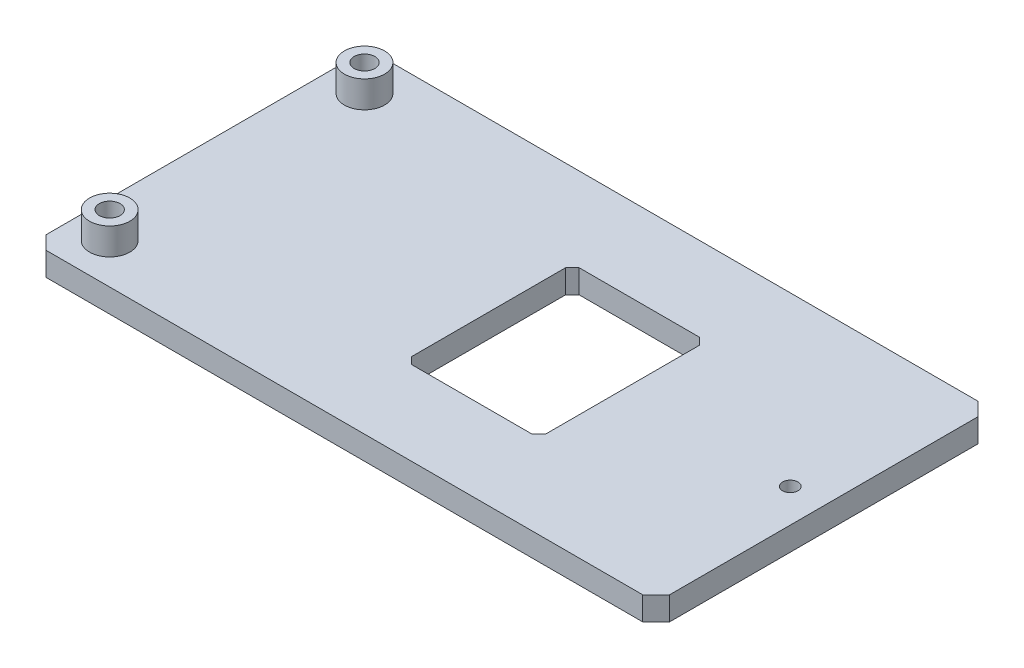
ISO-10303-21;
HEADER;
FILE_DESCRIPTION(('STEP AP214'),'2;1');
FILE_NAME('part.step','',(''),(''),'','','');
FILE_SCHEMA(('AUTOMOTIVE_DESIGN { 1 0 10303 214 1 1 1 1 }'));
ENDSEC;
DATA;
#1=APPLICATION_CONTEXT('core data for automotive mechanical design processes');
#2=APPLICATION_PROTOCOL_DEFINITION('international standard','automotive_design',2000,#1);
#3=PRODUCT_CONTEXT('',#1,'mechanical');
#4=PRODUCT('Part','Part','',(#3));
#5=PRODUCT_RELATED_PRODUCT_CATEGORY('part','',(#4));
#6=PRODUCT_DEFINITION_FORMATION('','',#4);
#7=PRODUCT_DEFINITION_CONTEXT('part definition',#1,'design');
#8=PRODUCT_DEFINITION('design','',#6,#7);
#9=PRODUCT_DEFINITION_SHAPE('','',#8);
#10=(LENGTH_UNIT() NAMED_UNIT(*) SI_UNIT(.MILLI.,.METRE.));
#11=(NAMED_UNIT(*) PLANE_ANGLE_UNIT() SI_UNIT($,.RADIAN.));
#12=(NAMED_UNIT(*) SI_UNIT($,.STERADIAN.) SOLID_ANGLE_UNIT());
#13=UNCERTAINTY_MEASURE_WITH_UNIT(LENGTH_MEASURE(1.E-05),#10,'distance_accuracy_value','');
#14=(GEOMETRIC_REPRESENTATION_CONTEXT(3) GLOBAL_UNCERTAINTY_ASSIGNED_CONTEXT((#13)) GLOBAL_UNIT_ASSIGNED_CONTEXT((#10,
#11,#12)) REPRESENTATION_CONTEXT('',''));
#15=CARTESIAN_POINT('',(0.,0.,0.));
#16=DIRECTION('',(0.,0.,1.));
#17=DIRECTION('',(1.,0.,0.));
#18=AXIS2_PLACEMENT_3D('',#15,#16,#17);
#19=CARTESIAN_POINT('',(0.,3.,0.));
#20=DIRECTION('',(0.,1.,0.));
#21=DIRECTION('',(0.,0.,1.));
#22=AXIS2_PLACEMENT_3D('',#19,#20,#21);
#23=PLANE('',#22);
#24=CARTESIAN_POINT('',(-45.1742624214534,3.,-19.));
#25=DIRECTION('',(0.,1.,0.));
#26=DIRECTION('',(0.,0.,1.));
#27=AXIS2_PLACEMENT_3D('',#24,#25,#26);
#28=CIRCLE('',#27,3.);
#29=CARTESIAN_POINT('',(-45.1742624214534,3.,-16.));
#30=VERTEX_POINT('',#29);
#31=EDGE_CURVE('E400',#30,#30,#28,.T.);
#32=ORIENTED_EDGE('',*,*,#31,.F.);
#33=EDGE_LOOP('',(#32));
#34=FACE_BOUND('',#33,.T.);
#35=DIRECTION('',(-0.707106781186546,0.,-0.707106781186549));
#36=VECTOR('',#35,1.);
#37=CARTESIAN_POINT('',(42.3257375785466,3.,-23.));
#38=LINE('',#37,#36);
#39=CARTESIAN_POINT('',(42.3257375785466,3.,-23.));
#40=VERTEX_POINT('',#39);
#41=CARTESIAN_POINT('',(40.3257375785466,3.,-25.));
#42=VERTEX_POINT('',#41);
#43=EDGE_CURVE('E195',#40,#42,#38,.T.);
#44=ORIENTED_EDGE('',*,*,#43,.T.);
#45=DIRECTION('',(-1.,0.,0.));
#46=VECTOR('',#45,1.);
#47=CARTESIAN_POINT('',(-48.6742624214534,3.,-25.));
#48=LINE('',#47,#46);
#49=CARTESIAN_POINT('',(-48.6742624214534,3.,-25.));
#50=VERTEX_POINT('',#49);
#51=EDGE_CURVE('E198',#42,#50,#48,.T.);
#52=ORIENTED_EDGE('',*,*,#51,.T.);
#53=DIRECTION('',(-0.707106781186547,0.,0.707106781186547));
#54=VECTOR('',#53,1.);
#55=CARTESIAN_POINT('',(-48.6742624214534,3.,-25.));
#56=LINE('',#55,#54);
#57=CARTESIAN_POINT('',(-50.6742624214534,3.,-23.));
#58=VERTEX_POINT('',#57);
#59=EDGE_CURVE('E201',#50,#58,#56,.T.);
#60=ORIENTED_EDGE('',*,*,#59,.T.);
#61=DIRECTION('',(0.,0.,1.));
#62=VECTOR('',#61,1.);
#63=CARTESIAN_POINT('',(-50.6742624214534,3.,-23.));
#64=LINE('',#63,#62);
#65=CARTESIAN_POINT('',(-50.6742624214534,3.,23.));
#66=VERTEX_POINT('',#65);
#67=EDGE_CURVE('E204',#58,#66,#64,.T.);
#68=ORIENTED_EDGE('',*,*,#67,.T.);
#69=DIRECTION('',(0.707106781186547,0.,0.707106781186547));
#70=VECTOR('',#69,1.);
#71=CARTESIAN_POINT('',(-50.6742624214534,3.,23.));
#72=LINE('',#71,#70);
#73=CARTESIAN_POINT('',(-48.6742624214534,3.,25.));
#74=VERTEX_POINT('',#73);
#75=EDGE_CURVE('E207',#66,#74,#72,.T.);
#76=ORIENTED_EDGE('',*,*,#75,.T.);
#77=DIRECTION('',(1.,0.,0.));
#78=VECTOR('',#77,1.);
#79=CARTESIAN_POINT('',(-48.6742624214534,3.,25.));
#80=LINE('',#79,#78);
#81=CARTESIAN_POINT('',(40.3257375785466,3.,25.));
#82=VERTEX_POINT('',#81);
#83=EDGE_CURVE('E210',#74,#82,#80,.T.);
#84=ORIENTED_EDGE('',*,*,#83,.T.);
#85=DIRECTION('',(0.707106781186546,0.,-0.707106781186549));
#86=VECTOR('',#85,1.);
#87=CARTESIAN_POINT('',(40.3257375785466,3.,25.));
#88=LINE('',#87,#86);
#89=CARTESIAN_POINT('',(42.3257375785466,3.,23.));
#90=VERTEX_POINT('',#89);
#91=EDGE_CURVE('E213',#82,#90,#88,.T.);
#92=ORIENTED_EDGE('',*,*,#91,.T.);
#93=DIRECTION('',(0.,0.,-1.));
#94=VECTOR('',#93,1.);
#95=CARTESIAN_POINT('',(42.3257375785466,3.,23.));
#96=LINE('',#95,#94);
#97=EDGE_CURVE('E216',#90,#40,#96,.T.);
#98=ORIENTED_EDGE('',*,*,#97,.T.);
#99=EDGE_LOOP('',(#44,#52,#60,#68,#76,#84,#92,#98));
#100=FACE_BOUND('',#99,.T.);
#101=CARTESIAN_POINT('',(37.3257375785466,3.,0.));
#102=DIRECTION('',(0.,1.,0.));
#103=DIRECTION('',(0.,0.,1.));
#104=AXIS2_PLACEMENT_3D('',#101,#102,#103);
#105=CIRCLE('',#104,1.15);
#106=CARTESIAN_POINT('',(37.3257375785466,3.,1.15));
#107=VERTEX_POINT('',#106);
#108=EDGE_CURVE('E192',#107,#107,#105,.T.);
#109=ORIENTED_EDGE('',*,*,#108,.F.);
#110=EDGE_LOOP('',(#109));
#111=FACE_BOUND('',#110,.T.);
#112=DIRECTION('',(-1.,0.,0.));
#113=VECTOR('',#112,1.);
#114=CARTESIAN_POINT('',(-6.67426242145343,3.,-12.5));
#115=LINE('',#114,#113);
#116=CARTESIAN_POINT('',(11.3257375785466,3.,-12.5));
#117=VERTEX_POINT('',#116);
#118=CARTESIAN_POINT('',(-6.67426242145343,3.,-12.5));
#119=VERTEX_POINT('',#118);
#120=EDGE_CURVE('E151',#117,#119,#115,.T.);
#121=ORIENTED_EDGE('',*,*,#120,.F.);
#122=DIRECTION('',(-0.707106781186547,0.,-0.707106781186547));
#123=VECTOR('',#122,1.);
#124=CARTESIAN_POINT('',(12.3257375785466,3.,-11.5));
#125=LINE('',#124,#123);
#126=CARTESIAN_POINT('',(12.3257375785466,3.,-11.5));
#127=VERTEX_POINT('',#126);
#128=EDGE_CURVE('E162',#127,#117,#125,.T.);
#129=ORIENTED_EDGE('',*,*,#128,.F.);
#130=DIRECTION('',(0.,0.,-1.));
#131=VECTOR('',#130,1.);
#132=CARTESIAN_POINT('',(12.3257375785466,3.,11.5));
#133=LINE('',#132,#131);
#134=CARTESIAN_POINT('',(12.3257375785466,3.,11.5));
#135=VERTEX_POINT('',#134);
#136=EDGE_CURVE('E190',#135,#127,#133,.T.);
#137=ORIENTED_EDGE('',*,*,#136,.F.);
#138=DIRECTION('',(0.707106781186547,0.,-0.707106781186547));
#139=VECTOR('',#138,1.);
#140=CARTESIAN_POINT('',(11.3257375785466,3.,12.5));
#141=LINE('',#140,#139);
#142=CARTESIAN_POINT('',(11.3257375785466,3.,12.5));
#143=VERTEX_POINT('',#142);
#144=EDGE_CURVE('E187',#143,#135,#141,.T.);
#145=ORIENTED_EDGE('',*,*,#144,.F.);
#146=DIRECTION('',(1.,0.,0.));
#147=VECTOR('',#146,1.);
#148=CARTESIAN_POINT('',(-6.67426242145343,3.,12.5));
#149=LINE('',#148,#147);
#150=CARTESIAN_POINT('',(-6.67426242145343,3.,12.5));
#151=VERTEX_POINT('',#150);
#152=EDGE_CURVE('E184',#151,#143,#149,.T.);
#153=ORIENTED_EDGE('',*,*,#152,.F.);
#154=DIRECTION('',(0.707106781186547,0.,0.707106781186548));
#155=VECTOR('',#154,1.);
#156=CARTESIAN_POINT('',(-6.67426242145343,3.,12.5));
#157=LINE('',#156,#155);
#158=CARTESIAN_POINT('',(-7.67426242145343,3.,11.5));
#159=VERTEX_POINT('',#158);
#160=EDGE_CURVE('E181',#159,#151,#157,.T.);
#161=ORIENTED_EDGE('',*,*,#160,.F.);
#162=DIRECTION('',(0.,0.,1.));
#163=VECTOR('',#162,1.);
#164=CARTESIAN_POINT('',(-7.67426242145343,3.,11.5));
#165=LINE('',#164,#163);
#166=CARTESIAN_POINT('',(-7.67426242145343,3.,-11.5));
#167=VERTEX_POINT('',#166);
#168=EDGE_CURVE('E175',#167,#159,#165,.T.);
#169=ORIENTED_EDGE('',*,*,#168,.F.);
#170=DIRECTION('',(-0.707106781186547,0.,0.707106781186548));
#171=VECTOR('',#170,1.);
#172=CARTESIAN_POINT('',(-7.67426242145343,3.,-11.5));
#173=LINE('',#172,#171);
#174=EDGE_CURVE('E173',#119,#167,#173,.T.);
#175=ORIENTED_EDGE('',*,*,#174,.F.);
#176=EDGE_LOOP('',(#121,#129,#137,#145,#153,#161,#169,#175));
#177=FACE_BOUND('',#176,.T.);
#178=CARTESIAN_POINT('',(-45.1742624214534,3.,19.));
#179=DIRECTION('',(0.,1.,0.));
#180=DIRECTION('',(0.,0.,-1.));
#181=AXIS2_PLACEMENT_3D('',#178,#179,#180);
#182=CIRCLE('',#181,3.);
#183=CARTESIAN_POINT('',(-45.1742624214534,3.,16.));
#184=VERTEX_POINT('',#183);
#185=EDGE_CURVE('E405',#184,#184,#182,.T.);
#186=ORIENTED_EDGE('',*,*,#185,.F.);
#187=EDGE_LOOP('',(#186));
#188=FACE_BOUND('',#187,.T.);
#189=ADVANCED_FACE('F33',(#34,#100,#111,#177,#188),#23,.T.);
#190=CARTESIAN_POINT('',(42.3257375785466,-0.506598951963253,-23.));
#191=DIRECTION('',(0.707106781186549,0.,-0.707106781186546));
#192=DIRECTION('',(-0.707106781186546,0.,-0.707106781186549));
#193=AXIS2_PLACEMENT_3D('',#190,#191,#192);
#194=PLANE('',#193);
#195=DIRECTION('',(0.,1.,0.));
#196=VECTOR('',#195,1.);
#197=CARTESIAN_POINT('',(40.3257375785466,-0.506598951963253,-25.));
#198=LINE('',#197,#196);
#199=CARTESIAN_POINT('',(40.3257375785466,-0.506598951963253,-25.));
#200=VERTEX_POINT('',#199);
#201=EDGE_CURVE('E37',#200,#42,#198,.T.);
#202=ORIENTED_EDGE('',*,*,#201,.T.);
#203=ORIENTED_EDGE('',*,*,#43,.F.);
#204=DIRECTION('',(0.,1.,0.));
#205=VECTOR('',#204,1.);
#206=CARTESIAN_POINT('',(42.3257375785466,-0.506598951963253,-23.));
#207=LINE('',#206,#205);
#208=CARTESIAN_POINT('',(42.3257375785466,-0.506598951963253,-23.));
#209=VERTEX_POINT('',#208);
#210=EDGE_CURVE('E11',#209,#40,#207,.T.);
#211=ORIENTED_EDGE('',*,*,#210,.F.);
#212=DIRECTION('',(-0.707106781186546,0.,-0.707106781186549));
#213=VECTOR('',#212,1.);
#214=CARTESIAN_POINT('',(42.3257375785466,-0.506598951963253,-23.));
#215=LINE('',#214,#213);
#216=EDGE_CURVE('E258',#209,#200,#215,.T.);
#217=ORIENTED_EDGE('',*,*,#216,.T.);
#218=EDGE_LOOP('',(#202,#203,#211,#217));
#219=FACE_BOUND('',#218,.T.);
#220=ADVANCED_FACE('F35',(#219),#194,.T.);
#221=CARTESIAN_POINT('',(42.3257375785466,-0.506598951963253,23.));
#222=DIRECTION('',(1.,0.,0.));
#223=DIRECTION('',(0.,0.,-1.));
#224=AXIS2_PLACEMENT_3D('',#221,#222,#223);
#225=PLANE('',#224);
#226=ORIENTED_EDGE('',*,*,#210,.T.);
#227=ORIENTED_EDGE('',*,*,#97,.F.);
#228=DIRECTION('',(0.,1.,0.));
#229=VECTOR('',#228,1.);
#230=CARTESIAN_POINT('',(42.3257375785466,-0.506598951963253,23.));
#231=LINE('',#230,#229);
#232=CARTESIAN_POINT('',(42.3257375785466,-0.506598951963253,23.));
#233=VERTEX_POINT('',#232);
#234=EDGE_CURVE('E42',#233,#90,#231,.T.);
#235=ORIENTED_EDGE('',*,*,#234,.F.);
#236=DIRECTION('',(0.,0.,-1.));
#237=VECTOR('',#236,1.);
#238=CARTESIAN_POINT('',(42.3257375785466,-0.506598951963253,23.));
#239=LINE('',#238,#237);
#240=EDGE_CURVE('E278',#233,#209,#239,.T.);
#241=ORIENTED_EDGE('',*,*,#240,.T.);
#242=EDGE_LOOP('',(#226,#227,#235,#241));
#243=FACE_BOUND('',#242,.T.);
#244=ADVANCED_FACE('F300',(#243),#225,.T.);
#245=CARTESIAN_POINT('',(40.3257375785466,-0.506598951963253,25.));
#246=DIRECTION('',(0.707106781186549,0.,0.707106781186546));
#247=DIRECTION('',(0.707106781186546,0.,-0.707106781186549));
#248=AXIS2_PLACEMENT_3D('',#245,#246,#247);
#249=PLANE('',#248);
#250=ORIENTED_EDGE('',*,*,#234,.T.);
#251=ORIENTED_EDGE('',*,*,#91,.F.);
#252=DIRECTION('',(0.,1.,0.));
#253=VECTOR('',#252,1.);
#254=CARTESIAN_POINT('',(40.3257375785466,-0.506598951963253,25.));
#255=LINE('',#254,#253);
#256=CARTESIAN_POINT('',(40.3257375785466,-0.506598951963253,25.));
#257=VERTEX_POINT('',#256);
#258=EDGE_CURVE('E282',#257,#82,#255,.T.);
#259=ORIENTED_EDGE('',*,*,#258,.F.);
#260=DIRECTION('',(0.707106781186546,0.,-0.707106781186549));
#261=VECTOR('',#260,1.);
#262=CARTESIAN_POINT('',(40.3257375785466,-0.506598951963253,25.));
#263=LINE('',#262,#261);
#264=EDGE_CURVE('E275',#257,#233,#263,.T.);
#265=ORIENTED_EDGE('',*,*,#264,.T.);
#266=EDGE_LOOP('',(#250,#251,#259,#265));
#267=FACE_BOUND('',#266,.T.);
#268=ADVANCED_FACE('F321',(#267),#249,.T.);
#269=CARTESIAN_POINT('',(-48.6742624214534,-0.506598951963253,25.));
#270=DIRECTION('',(0.,0.,1.));
#271=DIRECTION('',(1.,0.,0.));
#272=AXIS2_PLACEMENT_3D('',#269,#270,#271);
#273=PLANE('',#272);
#274=ORIENTED_EDGE('',*,*,#258,.T.);
#275=ORIENTED_EDGE('',*,*,#83,.F.);
#276=DIRECTION('',(0.,1.,0.));
#277=VECTOR('',#276,1.);
#278=CARTESIAN_POINT('',(-48.6742624214534,-0.506598951963253,25.));
#279=LINE('',#278,#277);
#280=CARTESIAN_POINT('',(-48.6742624214534,-0.506598951963253,25.));
#281=VERTEX_POINT('',#280);
#282=EDGE_CURVE('E284',#281,#74,#279,.T.);
#283=ORIENTED_EDGE('',*,*,#282,.F.);
#284=DIRECTION('',(1.,0.,0.));
#285=VECTOR('',#284,1.);
#286=CARTESIAN_POINT('',(-48.6742624214534,-0.506598951963253,25.));
#287=LINE('',#286,#285);
#288=EDGE_CURVE('E272',#281,#257,#287,.T.);
#289=ORIENTED_EDGE('',*,*,#288,.T.);
#290=EDGE_LOOP('',(#274,#275,#283,#289));
#291=FACE_BOUND('',#290,.T.);
#292=ADVANCED_FACE('F318',(#291),#273,.T.);
#293=CARTESIAN_POINT('',(-50.6742624214534,-0.506598951963253,23.));
#294=DIRECTION('',(-0.707106781186547,0.,0.707106781186547));
#295=DIRECTION('',(0.707106781186548,0.,0.707106781186548));
#296=AXIS2_PLACEMENT_3D('',#293,#294,#295);
#297=PLANE('',#296);
#298=ORIENTED_EDGE('',*,*,#282,.T.);
#299=ORIENTED_EDGE('',*,*,#75,.F.);
#300=DIRECTION('',(0.,1.,0.));
#301=VECTOR('',#300,1.);
#302=CARTESIAN_POINT('',(-50.6742624214534,-0.506598951963253,23.));
#303=LINE('',#302,#301);
#304=CARTESIAN_POINT('',(-50.6742624214534,-0.506598951963253,23.));
#305=VERTEX_POINT('',#304);
#306=EDGE_CURVE('E286',#305,#66,#303,.T.);
#307=ORIENTED_EDGE('',*,*,#306,.F.);
#308=DIRECTION('',(0.707106781186547,0.,0.707106781186547));
#309=VECTOR('',#308,1.);
#310=CARTESIAN_POINT('',(-50.6742624214534,-0.506598951963253,23.));
#311=LINE('',#310,#309);
#312=EDGE_CURVE('E269',#305,#281,#311,.T.);
#313=ORIENTED_EDGE('',*,*,#312,.T.);
#314=EDGE_LOOP('',(#298,#299,#307,#313));
#315=FACE_BOUND('',#314,.T.);
#316=ADVANCED_FACE('F316',(#315),#297,.T.);
#317=CARTESIAN_POINT('',(-50.6742624214534,-0.506598951963253,-23.));
#318=DIRECTION('',(-1.,0.,0.));
#319=DIRECTION('',(0.,0.,1.));
#320=AXIS2_PLACEMENT_3D('',#317,#318,#319);
#321=PLANE('',#320);
#322=ORIENTED_EDGE('',*,*,#306,.T.);
#323=ORIENTED_EDGE('',*,*,#67,.F.);
#324=DIRECTION('',(0.,1.,0.));
#325=VECTOR('',#324,1.);
#326=CARTESIAN_POINT('',(-50.6742624214534,-0.506598951963253,-23.));
#327=LINE('',#326,#325);
#328=CARTESIAN_POINT('',(-50.6742624214534,-0.506598951963253,-23.));
#329=VERTEX_POINT('',#328);
#330=EDGE_CURVE('E288',#329,#58,#327,.T.);
#331=ORIENTED_EDGE('',*,*,#330,.F.);
#332=DIRECTION('',(0.,0.,1.));
#333=VECTOR('',#332,1.);
#334=CARTESIAN_POINT('',(-50.6742624214534,-0.506598951963253,-23.));
#335=LINE('',#334,#333);
#336=EDGE_CURVE('E266',#329,#305,#335,.T.);
#337=ORIENTED_EDGE('',*,*,#336,.T.);
#338=EDGE_LOOP('',(#322,#323,#331,#337));
#339=FACE_BOUND('',#338,.T.);
#340=ADVANCED_FACE('F314',(#339),#321,.T.);
#341=CARTESIAN_POINT('',(-48.6742624214534,-0.506598951963253,-25.));
#342=DIRECTION('',(-0.707106781186547,0.,-0.707106781186547));
#343=DIRECTION('',(-0.707106781186548,0.,0.707106781186548));
#344=AXIS2_PLACEMENT_3D('',#341,#342,#343);
#345=PLANE('',#344);
#346=ORIENTED_EDGE('',*,*,#330,.T.);
#347=ORIENTED_EDGE('',*,*,#59,.F.);
#348=DIRECTION('',(0.,1.,0.));
#349=VECTOR('',#348,1.);
#350=CARTESIAN_POINT('',(-48.6742624214534,-0.506598951963253,-25.));
#351=LINE('',#350,#349);
#352=CARTESIAN_POINT('',(-48.6742624214534,-0.506598951963253,-25.));
#353=VERTEX_POINT('',#352);
#354=EDGE_CURVE('E289',#353,#50,#351,.T.);
#355=ORIENTED_EDGE('',*,*,#354,.F.);
#356=DIRECTION('',(-0.707106781186547,0.,0.707106781186547));
#357=VECTOR('',#356,1.);
#358=CARTESIAN_POINT('',(-48.6742624214534,-0.506598951963253,-25.));
#359=LINE('',#358,#357);
#360=EDGE_CURVE('E263',#353,#329,#359,.T.);
#361=ORIENTED_EDGE('',*,*,#360,.T.);
#362=EDGE_LOOP('',(#346,#347,#355,#361));
#363=FACE_BOUND('',#362,.T.);
#364=ADVANCED_FACE('F310',(#363),#345,.T.);
#365=CARTESIAN_POINT('',(-48.6742624214534,-0.506598951963253,-25.));
#366=DIRECTION('',(0.,0.,-1.));
#367=DIRECTION('',(-1.,0.,0.));
#368=AXIS2_PLACEMENT_3D('',#365,#366,#367);
#369=PLANE('',#368);
#370=ORIENTED_EDGE('',*,*,#354,.T.);
#371=ORIENTED_EDGE('',*,*,#51,.F.);
#372=ORIENTED_EDGE('',*,*,#201,.F.);
#373=DIRECTION('',(-1.,0.,0.));
#374=VECTOR('',#373,1.);
#375=CARTESIAN_POINT('',(-48.6742624214534,-0.506598951963253,-25.));
#376=LINE('',#375,#374);
#377=EDGE_CURVE('E260',#200,#353,#376,.T.);
#378=ORIENTED_EDGE('',*,*,#377,.T.);
#379=EDGE_LOOP('',(#370,#371,#372,#378));
#380=FACE_BOUND('',#379,.T.);
#381=ADVANCED_FACE('F293',(#380),#369,.T.);
#382=CARTESIAN_POINT('',(0.,-0.506598951963253,0.));
#383=DIRECTION('',(0.,1.,0.));
#384=DIRECTION('',(0.,0.,1.));
#385=AXIS2_PLACEMENT_3D('',#382,#383,#384);
#386=PLANE('',#385);
#387=DIRECTION('',(0.,0.,-1.));
#388=VECTOR('',#387,1.);
#389=CARTESIAN_POINT('',(12.3257375785466,-0.506598951963253,11.5));
#390=LINE('',#389,#388);
#391=CARTESIAN_POINT('',(12.3257375785466,-0.506598951963253,11.5));
#392=VERTEX_POINT('',#391);
#393=CARTESIAN_POINT('',(12.3257375785466,-0.506598951963253,-11.5));
#394=VERTEX_POINT('',#393);
#395=EDGE_CURVE('E159',#392,#394,#390,.T.);
#396=ORIENTED_EDGE('',*,*,#395,.T.);
#397=DIRECTION('',(-0.707106781186547,0.,-0.707106781186547));
#398=VECTOR('',#397,1.);
#399=CARTESIAN_POINT('',(12.3257375785466,-0.506598951963253,-11.5));
#400=LINE('',#399,#398);
#401=CARTESIAN_POINT('',(11.3257375785466,-0.506598951963253,-12.5));
#402=VERTEX_POINT('',#401);
#403=EDGE_CURVE('E219',#394,#402,#400,.T.);
#404=ORIENTED_EDGE('',*,*,#403,.T.);
#405=DIRECTION('',(-1.,0.,0.));
#406=VECTOR('',#405,1.);
#407=CARTESIAN_POINT('',(-6.67426242145343,-0.506598951963253,-12.5));
#408=LINE('',#407,#406);
#409=CARTESIAN_POINT('',(-6.67426242145343,-0.506598951963253,-12.5));
#410=VERTEX_POINT('',#409);
#411=EDGE_CURVE('E154',#402,#410,#408,.T.);
#412=ORIENTED_EDGE('',*,*,#411,.T.);
#413=DIRECTION('',(-0.707106781186547,0.,0.707106781186548));
#414=VECTOR('',#413,1.);
#415=CARTESIAN_POINT('',(-7.67426242145343,-0.506598951963253,-11.5));
#416=LINE('',#415,#414);
#417=CARTESIAN_POINT('',(-7.67426242145343,-0.506598951963253,-11.5));
#418=VERTEX_POINT('',#417);
#419=EDGE_CURVE('E50',#410,#418,#416,.T.);
#420=ORIENTED_EDGE('',*,*,#419,.T.);
#421=DIRECTION('',(0.,0.,1.));
#422=VECTOR('',#421,1.);
#423=CARTESIAN_POINT('',(-7.67426242145343,-0.506598951963253,11.5));
#424=LINE('',#423,#422);
#425=CARTESIAN_POINT('',(-7.67426242145343,-0.506598951963253,11.5));
#426=VERTEX_POINT('',#425);
#427=EDGE_CURVE('E223',#418,#426,#424,.T.);
#428=ORIENTED_EDGE('',*,*,#427,.T.);
#429=DIRECTION('',(0.707106781186547,0.,0.707106781186548));
#430=VECTOR('',#429,1.);
#431=CARTESIAN_POINT('',(-6.67426242145343,-0.506598951963253,12.5));
#432=LINE('',#431,#430);
#433=CARTESIAN_POINT('',(-6.67426242145343,-0.506598951963253,12.5));
#434=VERTEX_POINT('',#433);
#435=EDGE_CURVE('E226',#426,#434,#432,.T.);
#436=ORIENTED_EDGE('',*,*,#435,.T.);
#437=DIRECTION('',(1.,0.,0.));
#438=VECTOR('',#437,1.);
#439=CARTESIAN_POINT('',(-6.67426242145343,-0.506598951963253,12.5));
#440=LINE('',#439,#438);
#441=CARTESIAN_POINT('',(11.3257375785466,-0.506598951963253,12.5));
#442=VERTEX_POINT('',#441);
#443=EDGE_CURVE('E229',#434,#442,#440,.T.);
#444=ORIENTED_EDGE('',*,*,#443,.T.);
#445=DIRECTION('',(0.707106781186547,0.,-0.707106781186547));
#446=VECTOR('',#445,1.);
#447=CARTESIAN_POINT('',(11.3257375785466,-0.506598951963253,12.5));
#448=LINE('',#447,#446);
#449=EDGE_CURVE('E232',#442,#392,#448,.T.);
#450=ORIENTED_EDGE('',*,*,#449,.T.);
#451=EDGE_LOOP('',(#396,#404,#412,#420,#428,#436,#444,#450));
#452=FACE_BOUND('',#451,.T.);
#453=CARTESIAN_POINT('',(37.3257375785466,-0.506598951963253,0.));
#454=DIRECTION('',(0.,1.,0.));
#455=DIRECTION('',(0.,0.,1.));
#456=AXIS2_PLACEMENT_3D('',#453,#454,#455);
#457=CIRCLE('',#456,1.15);
#458=CARTESIAN_POINT('',(37.3257375785466,-0.506598951963253,1.15));
#459=VERTEX_POINT('',#458);
#460=EDGE_CURVE('E238',#459,#459,#457,.T.);
#461=ORIENTED_EDGE('',*,*,#460,.T.);
#462=EDGE_LOOP('',(#461));
#463=FACE_BOUND('',#462,.T.);
#464=CARTESIAN_POINT('',(-45.1742624214534,-0.506598951963253,19.));
#465=DIRECTION('',(0.,1.,0.));
#466=DIRECTION('',(0.,0.,-1.));
#467=AXIS2_PLACEMENT_3D('',#464,#465,#466);
#468=CIRCLE('',#467,1.55);
#469=CARTESIAN_POINT('',(-45.1742624214534,-0.506598951963253,17.45));
#470=VERTEX_POINT('',#469);
#471=EDGE_CURVE('E252',#470,#470,#468,.T.);
#472=ORIENTED_EDGE('',*,*,#471,.T.);
#473=EDGE_LOOP('',(#472));
#474=FACE_BOUND('',#473,.T.);
#475=CARTESIAN_POINT('',(-45.1742624214534,-0.506598951963253,-19.));
#476=DIRECTION('',(0.,1.,0.));
#477=DIRECTION('',(0.,0.,1.));
#478=AXIS2_PLACEMENT_3D('',#475,#476,#477);
#479=CIRCLE('',#478,1.55);
#480=CARTESIAN_POINT('',(-45.1742624214534,-0.506598951963253,-17.45));
#481=VERTEX_POINT('',#480);
#482=EDGE_CURVE('E255',#481,#481,#479,.T.);
#483=ORIENTED_EDGE('',*,*,#482,.T.);
#484=EDGE_LOOP('',(#483));
#485=FACE_BOUND('',#484,.T.);
#486=ORIENTED_EDGE('',*,*,#216,.F.);
#487=ORIENTED_EDGE('',*,*,#240,.F.);
#488=ORIENTED_EDGE('',*,*,#264,.F.);
#489=ORIENTED_EDGE('',*,*,#288,.F.);
#490=ORIENTED_EDGE('',*,*,#312,.F.);
#491=ORIENTED_EDGE('',*,*,#336,.F.);
#492=ORIENTED_EDGE('',*,*,#360,.F.);
#493=ORIENTED_EDGE('',*,*,#377,.F.);
#494=EDGE_LOOP('',(#486,#487,#488,#489,#490,#491,#492,#493));
#495=FACE_BOUND('',#494,.T.);
#496=ADVANCED_FACE('F304',(#452,#463,#474,#485,#495),#386,.F.);
#497=CARTESIAN_POINT('',(-45.1742624214534,-0.506598951963253,-19.));
#498=DIRECTION('',(0.,1.,0.));
#499=DIRECTION('',(0.,0.,1.));
#500=AXIS2_PLACEMENT_3D('',#497,#498,#499);
#501=CYLINDRICAL_SURFACE('',#500,1.55);
#502=ORIENTED_EDGE('',*,*,#482,.F.);
#503=EDGE_LOOP('',(#502));
#504=FACE_BOUND('',#503,.T.);
#505=CARTESIAN_POINT('',(-45.1742624214534,7.,-19.));
#506=DIRECTION('',(0.,1.,0.));
#507=DIRECTION('',(0.,0.,1.));
#508=AXIS2_PLACEMENT_3D('',#505,#506,#507);
#509=CIRCLE('',#508,1.55);
#510=CARTESIAN_POINT('',(-45.1742624214534,7.,-17.45));
#511=VERTEX_POINT('',#510);
#512=EDGE_CURVE('E398',#511,#511,#509,.T.);
#513=ORIENTED_EDGE('',*,*,#512,.T.);
#514=EDGE_LOOP('',(#513));
#515=FACE_BOUND('',#514,.T.);
#516=ADVANCED_FACE('F378',(#504,#515),#501,.F.);
#517=CARTESIAN_POINT('',(-45.1742624214534,-0.506598951963253,19.));
#518=DIRECTION('',(0.,1.,0.));
#519=DIRECTION('',(0.,0.,1.));
#520=AXIS2_PLACEMENT_3D('',#517,#518,#519);
#521=CYLINDRICAL_SURFACE('',#520,1.55);
#522=ORIENTED_EDGE('',*,*,#471,.F.);
#523=EDGE_LOOP('',(#522));
#524=FACE_BOUND('',#523,.T.);
#525=CARTESIAN_POINT('',(-45.1742624214534,7.,19.));
#526=DIRECTION('',(0.,1.,0.));
#527=DIRECTION('',(0.,0.,-1.));
#528=AXIS2_PLACEMENT_3D('',#525,#526,#527);
#529=CIRCLE('',#528,1.55);
#530=CARTESIAN_POINT('',(-45.1742624214534,7.,17.45));
#531=VERTEX_POINT('',#530);
#532=EDGE_CURVE('E434',#531,#531,#529,.T.);
#533=ORIENTED_EDGE('',*,*,#532,.T.);
#534=EDGE_LOOP('',(#533));
#535=FACE_BOUND('',#534,.T.);
#536=ADVANCED_FACE('F374',(#524,#535),#521,.F.);
#537=CARTESIAN_POINT('',(37.3257375785466,-0.506598951963253,0.));
#538=DIRECTION('',(0.,1.,0.));
#539=DIRECTION('',(0.,0.,1.));
#540=AXIS2_PLACEMENT_3D('',#537,#538,#539);
#541=CYLINDRICAL_SURFACE('',#540,1.15);
#542=ORIENTED_EDGE('',*,*,#460,.F.);
#543=EDGE_LOOP('',(#542));
#544=FACE_BOUND('',#543,.T.);
#545=ORIENTED_EDGE('',*,*,#108,.T.);
#546=EDGE_LOOP('',(#545));
#547=FACE_BOUND('',#546,.T.);
#548=ADVANCED_FACE('F371',(#544,#547),#541,.F.);
#549=CARTESIAN_POINT('',(12.3257375785466,-0.506598951963253,-11.5));
#550=DIRECTION('',(0.707106781186547,0.,-0.707106781186547));
#551=DIRECTION('',(-0.707106781186548,0.,-0.707106781186548));
#552=AXIS2_PLACEMENT_3D('',#549,#550,#551);
#553=PLANE('',#552);
#554=DIRECTION('',(0.,1.,0.));
#555=VECTOR('',#554,1.);
#556=CARTESIAN_POINT('',(12.3257375785466,-0.506598951963253,-11.5));
#557=LINE('',#556,#555);
#558=EDGE_CURVE('E164',#394,#127,#557,.T.);
#559=ORIENTED_EDGE('',*,*,#558,.T.);
#560=ORIENTED_EDGE('',*,*,#128,.T.);
#561=DIRECTION('',(0.,1.,0.));
#562=VECTOR('',#561,1.);
#563=CARTESIAN_POINT('',(11.3257375785466,-0.506598951963253,-12.5));
#564=LINE('',#563,#562);
#565=EDGE_CURVE('E147',#402,#117,#564,.T.);
#566=ORIENTED_EDGE('',*,*,#565,.F.);
#567=ORIENTED_EDGE('',*,*,#403,.F.);
#568=EDGE_LOOP('',(#559,#560,#566,#567));
#569=FACE_BOUND('',#568,.T.);
#570=ADVANCED_FACE('F163',(#569),#553,.F.);
#571=CARTESIAN_POINT('',(12.3257375785466,-0.506598951963253,11.5));
#572=DIRECTION('',(1.,0.,0.));
#573=DIRECTION('',(0.,0.,-1.));
#574=AXIS2_PLACEMENT_3D('',#571,#572,#573);
#575=PLANE('',#574);
#576=DIRECTION('',(0.,1.,0.));
#577=VECTOR('',#576,1.);
#578=CARTESIAN_POINT('',(12.3257375785466,-0.506598951963253,11.5));
#579=LINE('',#578,#577);
#580=EDGE_CURVE('E239',#392,#135,#579,.T.);
#581=ORIENTED_EDGE('',*,*,#580,.T.);
#582=ORIENTED_EDGE('',*,*,#136,.T.);
#583=ORIENTED_EDGE('',*,*,#558,.F.);
#584=ORIENTED_EDGE('',*,*,#395,.F.);
#585=EDGE_LOOP('',(#581,#582,#583,#584));
#586=FACE_BOUND('',#585,.T.);
#587=ADVANCED_FACE('F343',(#586),#575,.F.);
#588=CARTESIAN_POINT('',(11.3257375785466,-0.506598951963253,12.5));
#589=DIRECTION('',(0.707106781186547,0.,0.707106781186547));
#590=DIRECTION('',(0.707106781186548,0.,-0.707106781186548));
#591=AXIS2_PLACEMENT_3D('',#588,#589,#590);
#592=PLANE('',#591);
#593=DIRECTION('',(0.,1.,0.));
#594=VECTOR('',#593,1.);
#595=CARTESIAN_POINT('',(11.3257375785466,-0.506598951963253,12.5));
#596=LINE('',#595,#594);
#597=EDGE_CURVE('E241',#442,#143,#596,.T.);
#598=ORIENTED_EDGE('',*,*,#597,.T.);
#599=ORIENTED_EDGE('',*,*,#144,.T.);
#600=ORIENTED_EDGE('',*,*,#580,.F.);
#601=ORIENTED_EDGE('',*,*,#449,.F.);
#602=EDGE_LOOP('',(#598,#599,#600,#601));
#603=FACE_BOUND('',#602,.T.);
#604=ADVANCED_FACE('F346',(#603),#592,.F.);
#605=CARTESIAN_POINT('',(-6.67426242145343,-0.506598951963253,12.5));
#606=DIRECTION('',(0.,0.,1.));
#607=DIRECTION('',(1.,0.,0.));
#608=AXIS2_PLACEMENT_3D('',#605,#606,#607);
#609=PLANE('',#608);
#610=DIRECTION('',(0.,1.,0.));
#611=VECTOR('',#610,1.);
#612=CARTESIAN_POINT('',(-6.67426242145343,-0.506598951963253,12.5));
#613=LINE('',#612,#611);
#614=EDGE_CURVE('E243',#434,#151,#613,.T.);
#615=ORIENTED_EDGE('',*,*,#614,.T.);
#616=ORIENTED_EDGE('',*,*,#152,.T.);
#617=ORIENTED_EDGE('',*,*,#597,.F.);
#618=ORIENTED_EDGE('',*,*,#443,.F.);
#619=EDGE_LOOP('',(#615,#616,#617,#618));
#620=FACE_BOUND('',#619,.T.);
#621=ADVANCED_FACE('F350',(#620),#609,.F.);
#622=CARTESIAN_POINT('',(-6.67426242145343,-0.506598951963253,12.5));
#623=DIRECTION('',(-0.707106781186548,0.,0.707106781186547));
#624=DIRECTION('',(0.707106781186547,0.,0.707106781186548));
#625=AXIS2_PLACEMENT_3D('',#622,#623,#624);
#626=PLANE('',#625);
#627=DIRECTION('',(0.,1.,0.));
#628=VECTOR('',#627,1.);
#629=CARTESIAN_POINT('',(-7.67426242145343,-0.506598951963253,11.5));
#630=LINE('',#629,#628);
#631=EDGE_CURVE('E245',#426,#159,#630,.T.);
#632=ORIENTED_EDGE('',*,*,#631,.T.);
#633=ORIENTED_EDGE('',*,*,#160,.T.);
#634=ORIENTED_EDGE('',*,*,#614,.F.);
#635=ORIENTED_EDGE('',*,*,#435,.F.);
#636=EDGE_LOOP('',(#632,#633,#634,#635));
#637=FACE_BOUND('',#636,.T.);
#638=ADVANCED_FACE('F354',(#637),#626,.F.);
#639=CARTESIAN_POINT('',(-7.67426242145343,-0.506598951963253,11.5));
#640=DIRECTION('',(-1.,0.,0.));
#641=DIRECTION('',(0.,0.,1.));
#642=AXIS2_PLACEMENT_3D('',#639,#640,#641);
#643=PLANE('',#642);
#644=DIRECTION('',(0.,1.,0.));
#645=VECTOR('',#644,1.);
#646=CARTESIAN_POINT('',(-7.67426242145343,-0.506598951963253,-11.5));
#647=LINE('',#646,#645);
#648=EDGE_CURVE('E247',#418,#167,#647,.T.);
#649=ORIENTED_EDGE('',*,*,#648,.T.);
#650=ORIENTED_EDGE('',*,*,#168,.T.);
#651=ORIENTED_EDGE('',*,*,#631,.F.);
#652=ORIENTED_EDGE('',*,*,#427,.F.);
#653=EDGE_LOOP('',(#649,#650,#651,#652));
#654=FACE_BOUND('',#653,.T.);
#655=ADVANCED_FACE('F358',(#654),#643,.F.);
#656=CARTESIAN_POINT('',(-7.67426242145343,-0.506598951963253,-11.5));
#657=DIRECTION('',(-0.707106781186548,0.,-0.707106781186547));
#658=DIRECTION('',(-0.707106781186547,0.,0.707106781186548));
#659=AXIS2_PLACEMENT_3D('',#656,#657,#658);
#660=PLANE('',#659);
#661=DIRECTION('',(0.,1.,0.));
#662=VECTOR('',#661,1.);
#663=CARTESIAN_POINT('',(-6.67426242145343,-0.506598951963253,-12.5));
#664=LINE('',#663,#662);
#665=EDGE_CURVE('E158',#410,#119,#664,.T.);
#666=ORIENTED_EDGE('',*,*,#665,.T.);
#667=ORIENTED_EDGE('',*,*,#174,.T.);
#668=ORIENTED_EDGE('',*,*,#648,.F.);
#669=ORIENTED_EDGE('',*,*,#419,.F.);
#670=EDGE_LOOP('',(#666,#667,#668,#669));
#671=FACE_BOUND('',#670,.T.);
#672=ADVANCED_FACE('F362',(#671),#660,.F.);
#673=CARTESIAN_POINT('',(-6.67426242145343,-0.506598951963253,-12.5));
#674=DIRECTION('',(0.,0.,-1.));
#675=DIRECTION('',(-1.,0.,0.));
#676=AXIS2_PLACEMENT_3D('',#673,#674,#675);
#677=PLANE('',#676);
#678=ORIENTED_EDGE('',*,*,#565,.T.);
#679=ORIENTED_EDGE('',*,*,#120,.T.);
#680=ORIENTED_EDGE('',*,*,#665,.F.);
#681=ORIENTED_EDGE('',*,*,#411,.F.);
#682=EDGE_LOOP('',(#678,#679,#680,#681));
#683=FACE_BOUND('',#682,.T.);
#684=ADVANCED_FACE('F149',(#683),#677,.F.);
#685=CARTESIAN_POINT('',(-45.1742624214534,7.,-19.));
#686=DIRECTION('',(0.,1.,0.));
#687=DIRECTION('',(0.,0.,1.));
#688=AXIS2_PLACEMENT_3D('',#685,#686,#687);
#689=PLANE('',#688);
#690=CARTESIAN_POINT('',(-45.1742624214534,7.,-19.));
#691=DIRECTION('',(0.,1.,0.));
#692=DIRECTION('',(0.,0.,1.));
#693=AXIS2_PLACEMENT_3D('',#690,#691,#692);
#694=CIRCLE('',#693,3.);
#695=CARTESIAN_POINT('',(-45.1742624214534,7.,-16.));
#696=VERTEX_POINT('',#695);
#697=EDGE_CURVE('E168',#696,#696,#694,.T.);
#698=ORIENTED_EDGE('',*,*,#697,.T.);
#699=EDGE_LOOP('',(#698));
#700=FACE_BOUND('',#699,.T.);
#701=ORIENTED_EDGE('',*,*,#512,.F.);
#702=EDGE_LOOP('',(#701));
#703=FACE_BOUND('',#702,.T.);
#704=ADVANCED_FACE('F368',(#700,#703),#689,.T.);
#705=CARTESIAN_POINT('',(-45.1742624214534,7.,-19.));
#706=DIRECTION('',(0.,-1.,0.));
#707=DIRECTION('',(0.,0.,-1.));
#708=AXIS2_PLACEMENT_3D('',#705,#706,#707);
#709=CYLINDRICAL_SURFACE('',#708,3.);
#710=ORIENTED_EDGE('',*,*,#697,.F.);
#711=EDGE_LOOP('',(#710));
#712=FACE_BOUND('',#711,.T.);
#713=ORIENTED_EDGE('',*,*,#31,.T.);
#714=EDGE_LOOP('',(#713));
#715=FACE_BOUND('',#714,.T.);
#716=ADVANCED_FACE('F341',(#712,#715),#709,.T.);
#717=CARTESIAN_POINT('',(-45.1742624214534,7.,19.));
#718=DIRECTION('',(0.,-1.,0.));
#719=DIRECTION('',(0.,0.,-1.));
#720=AXIS2_PLACEMENT_3D('',#717,#718,#719);
#721=PLANE('',#720);
#722=CARTESIAN_POINT('',(-45.1742624214534,7.,19.));
#723=DIRECTION('',(0.,1.,0.));
#724=DIRECTION('',(0.,0.,-1.));
#725=AXIS2_PLACEMENT_3D('',#722,#723,#724);
#726=CIRCLE('',#725,3.);
#727=CARTESIAN_POINT('',(-45.1742624214534,7.,16.));
#728=VERTEX_POINT('',#727);
#729=EDGE_CURVE('E401',#728,#728,#726,.T.);
#730=ORIENTED_EDGE('',*,*,#729,.T.);
#731=EDGE_LOOP('',(#730));
#732=FACE_BOUND('',#731,.T.);
#733=ORIENTED_EDGE('',*,*,#532,.F.);
#734=EDGE_LOOP('',(#733));
#735=FACE_BOUND('',#734,.T.);
#736=ADVANCED_FACE('F415',(#732,#735),#721,.F.);
#737=CARTESIAN_POINT('',(-45.1742624214534,7.,19.));
#738=DIRECTION('',(0.,-1.,0.));
#739=DIRECTION('',(0.,0.,-1.));
#740=AXIS2_PLACEMENT_3D('',#737,#738,#739);
#741=CYLINDRICAL_SURFACE('',#740,3.);
#742=ORIENTED_EDGE('',*,*,#729,.F.);
#743=EDGE_LOOP('',(#742));
#744=FACE_BOUND('',#743,.T.);
#745=ORIENTED_EDGE('',*,*,#185,.T.);
#746=EDGE_LOOP('',(#745));
#747=FACE_BOUND('',#746,.T.);
#748=ADVANCED_FACE('F420',(#744,#747),#741,.T.);
#749=CLOSED_SHELL('',(#189,#220,#244,#268,#292,#316,#340,#364,#381,#496,#516,#536,#548,#570,
#587,#604,#621,#638,#655,#672,#684,#704,#716,#736,#748));
#750=MANIFOLD_SOLID_BREP('B2',#749);
#751=ADVANCED_BREP_SHAPE_REPRESENTATION('',(#18,#750),#14);
#752=SHAPE_DEFINITION_REPRESENTATION(#9,#751);
ENDSEC;
END-ISO-10303-21;
